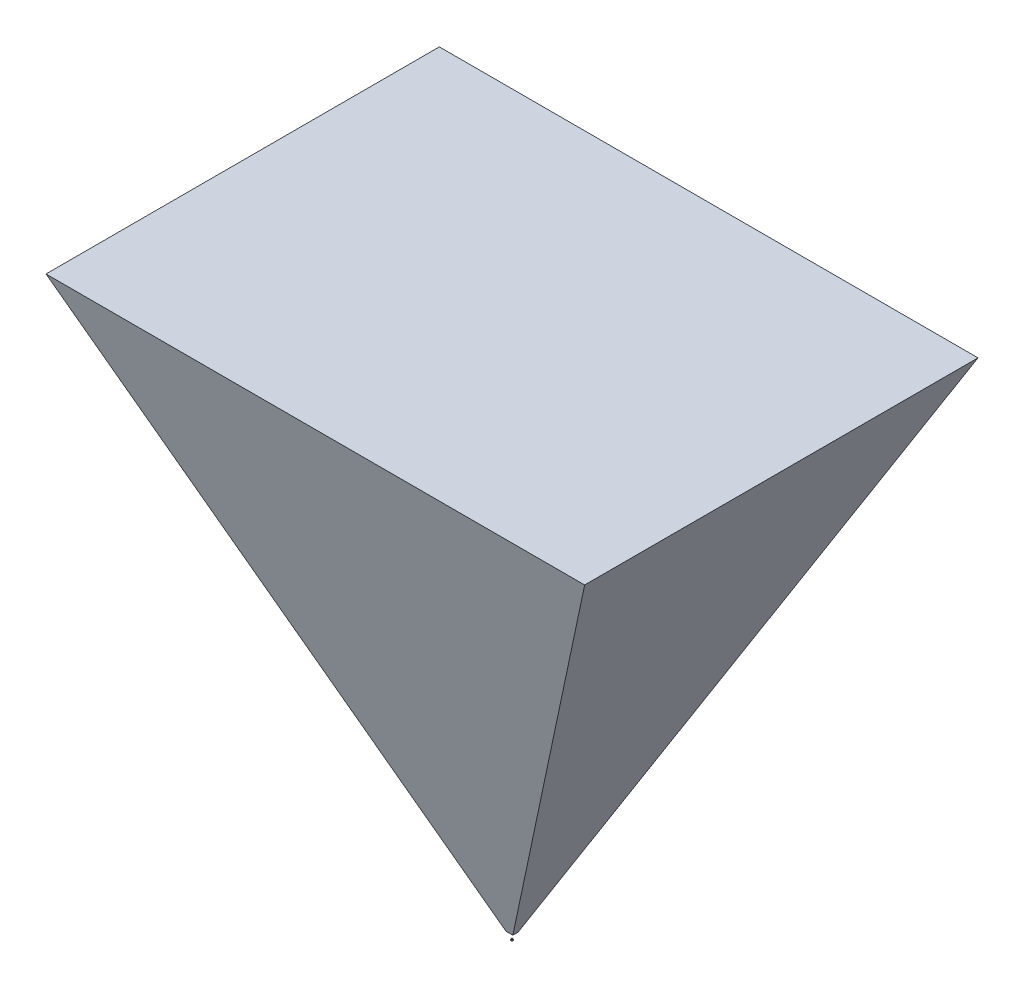
ISO-10303-21;
HEADER;
FILE_DESCRIPTION(('STEP AP214'),'2;1');
FILE_NAME('part.step','',(''),(''),'','','');
FILE_SCHEMA(('AUTOMOTIVE_DESIGN { 1 0 10303 214 1 1 1 1 }'));
ENDSEC;
DATA;
#1=APPLICATION_CONTEXT('core data for automotive mechanical design processes');
#2=APPLICATION_PROTOCOL_DEFINITION('international standard','automotive_design',2000,#1);
#3=PRODUCT_CONTEXT('',#1,'mechanical');
#4=PRODUCT('Part','Part','',(#3));
#5=PRODUCT_RELATED_PRODUCT_CATEGORY('part','',(#4));
#6=PRODUCT_DEFINITION_FORMATION('','',#4);
#7=PRODUCT_DEFINITION_CONTEXT('part definition',#1,'design');
#8=PRODUCT_DEFINITION('design','',#6,#7);
#9=PRODUCT_DEFINITION_SHAPE('','',#8);
#10=(LENGTH_UNIT() NAMED_UNIT(*) SI_UNIT(.MILLI.,.METRE.));
#11=(NAMED_UNIT(*) PLANE_ANGLE_UNIT() SI_UNIT($,.RADIAN.));
#12=(NAMED_UNIT(*) SI_UNIT($,.STERADIAN.) SOLID_ANGLE_UNIT());
#13=UNCERTAINTY_MEASURE_WITH_UNIT(LENGTH_MEASURE(1.E-05),#10,'distance_accuracy_value','');
#14=(GEOMETRIC_REPRESENTATION_CONTEXT(3) GLOBAL_UNCERTAINTY_ASSIGNED_CONTEXT((#13)) GLOBAL_UNIT_ASSIGNED_CONTEXT((#10,
#11,#12)) REPRESENTATION_CONTEXT('',''));
#15=CARTESIAN_POINT('',(0.,0.,0.));
#16=DIRECTION('',(0.,0.,1.));
#17=DIRECTION('',(1.,0.,0.));
#18=AXIS2_PLACEMENT_3D('',#15,#16,#17);
#19=CARTESIAN_POINT('',(1500.,1548.70782661284,564.153863112612));
#20=DIRECTION('',(0.,-1.,0.));
#21=DIRECTION('',(0.,0.,-1.));
#22=AXIS2_PLACEMENT_3D('',#19,#20,#21);
#23=PLANE('',#22);
#24=DIRECTION('',(0.,0.,1.));
#25=VECTOR('',#24,1.);
#26=CARTESIAN_POINT('',(-772.570341414146,1548.70782661284,-564.153863112612));
#27=LINE('',#26,#25);
#28=CARTESIAN_POINT('',(-772.570341414146,1548.70782661284,-564.153863112612));
#29=VERTEX_POINT('',#28);
#30=CARTESIAN_POINT('',(-772.570341414146,1548.70782661284,564.153863112612));
#31=VERTEX_POINT('',#30);
#32=EDGE_CURVE('E66',#29,#31,#27,.T.);
#33=ORIENTED_EDGE('',*,*,#32,.T.);
#34=DIRECTION('',(-1.,0.,0.));
#35=VECTOR('',#34,1.);
#36=CARTESIAN_POINT('',(1500.,1548.70782661284,564.153863112612));
#37=LINE('',#36,#35);
#38=CARTESIAN_POINT('',(772.570341414146,1548.70782661284,564.153863112612));
#39=VERTEX_POINT('',#38);
#40=EDGE_CURVE('E96',#39,#31,#37,.T.);
#41=ORIENTED_EDGE('',*,*,#40,.F.);
#42=DIRECTION('',(0.,0.,1.));
#43=VECTOR('',#42,1.);
#44=CARTESIAN_POINT('',(772.570341414146,1548.70782661284,-564.153863112612));
#45=LINE('',#44,#43);
#46=CARTESIAN_POINT('',(772.570341414146,1548.70782661284,-564.153863112612));
#47=VERTEX_POINT('',#46);
#48=EDGE_CURVE('E82',#47,#39,#45,.T.);
#49=ORIENTED_EDGE('',*,*,#48,.F.);
#50=DIRECTION('',(-1.,0.,0.));
#51=VECTOR('',#50,1.);
#52=CARTESIAN_POINT('',(1500.,1548.70782661284,-564.153863112612));
#53=LINE('',#52,#51);
#54=EDGE_CURVE('E108',#47,#29,#53,.T.);
#55=ORIENTED_EDGE('',*,*,#54,.T.);
#56=EDGE_LOOP('',(#33,#41,#49,#55));
#57=FACE_BOUND('',#56,.T.);
#58=ADVANCED_FACE('F45',(#57),#23,.F.);
#59=CARTESIAN_POINT('',(1500.,18.7078266128409,7.27940468532404));
#60=DIRECTION('',(0.,0.342020143325668,-0.939692620785909));
#61=DIRECTION('',(0.,0.939692620785909,0.342020143325668));
#62=AXIS2_PLACEMENT_3D('',#59,#60,#61);
#63=PLANE('',#62);
#64=DIRECTION('',(-0.424258256279284,0.850930418263275,0.309713343679521));
#65=VECTOR('',#64,1.);
#66=CARTESIAN_POINT('',(262.0053594961,-526.330009117692,-191.098144069461));
#67=LINE('',#66,#65);
#68=CARTESIAN_POINT('',(-9.7404810923923,18.7078266128409,7.27940468532406));
#69=VERTEX_POINT('',#68);
#70=EDGE_CURVE('E99',#69,#31,#67,.T.);
#71=ORIENTED_EDGE('',*,*,#70,.F.);
#72=DIRECTION('',(-1.,0.,0.));
#73=VECTOR('',#72,1.);
#74=CARTESIAN_POINT('',(1500.,18.7078266128409,7.27940468532404));
#75=LINE('',#74,#73);
#76=CARTESIAN_POINT('',(9.7404810923923,18.7078266128409,7.27940468532406));
#77=VERTEX_POINT('',#76);
#78=EDGE_CURVE('E98',#77,#69,#75,.T.);
#79=ORIENTED_EDGE('',*,*,#78,.F.);
#80=DIRECTION('',(-0.424258256279284,-0.850930418263275,-0.309713343679521));
#81=VECTOR('',#80,1.);
#82=CARTESIAN_POINT('',(277.979844567317,556.712757284446,203.097185338239));
#83=LINE('',#82,#81);
#84=EDGE_CURVE('E85',#39,#77,#83,.T.);
#85=ORIENTED_EDGE('',*,*,#84,.F.);
#86=ORIENTED_EDGE('',*,*,#40,.T.);
#87=EDGE_LOOP('',(#71,#79,#85,#86));
#88=FACE_BOUND('',#87,.T.);
#89=ADVANCED_FACE('F95',(#88),#63,.F.);
#90=CARTESIAN_POINT('',(1500.,18.7078266128409,7.27940468532404));
#91=DIRECTION('',(0.,1.,0.));
#92=DIRECTION('',(0.,0.,1.));
#93=AXIS2_PLACEMENT_3D('',#90,#91,#92);
#94=PLANE('',#93);
#95=DIRECTION('',(0.,0.,1.));
#96=VECTOR('',#95,1.);
#97=CARTESIAN_POINT('',(-9.7404810923923,18.7078266128409,-564.153863112612));
#98=LINE('',#97,#96);
#99=CARTESIAN_POINT('',(-9.74048109239227,18.7078266128409,-7.27940468532404));
#100=VERTEX_POINT('',#99);
#101=EDGE_CURVE('E100',#100,#69,#98,.T.);
#102=ORIENTED_EDGE('',*,*,#101,.F.);
#103=DIRECTION('',(-1.,0.,0.));
#104=VECTOR('',#103,1.);
#105=CARTESIAN_POINT('',(1500.,18.7078266128409,-7.27940468532404));
#106=LINE('',#105,#104);
#107=CARTESIAN_POINT('',(9.7404810923922,18.7078266128409,-7.27940468532405));
#108=VERTEX_POINT('',#107);
#109=EDGE_CURVE('E103',#108,#100,#106,.T.);
#110=ORIENTED_EDGE('',*,*,#109,.F.);
#111=DIRECTION('',(0.,0.,1.));
#112=VECTOR('',#111,1.);
#113=CARTESIAN_POINT('',(9.7404810923923,18.7078266128409,-564.153863112612));
#114=LINE('',#113,#112);
#115=EDGE_CURVE('E59',#108,#77,#114,.T.);
#116=ORIENTED_EDGE('',*,*,#115,.T.);
#117=ORIENTED_EDGE('',*,*,#78,.T.);
#118=EDGE_LOOP('',(#102,#110,#116,#117));
#119=FACE_BOUND('',#118,.T.);
#120=ADVANCED_FACE('F117',(#119),#94,.F.);
#121=CARTESIAN_POINT('',(1500.,18.7078266128409,-7.27940468532404));
#122=DIRECTION('',(0.,0.342020143325668,0.939692620785909));
#123=DIRECTION('',(0.,-0.939692620785909,0.342020143325668));
#124=AXIS2_PLACEMENT_3D('',#121,#122,#123);
#125=PLANE('',#124);
#126=DIRECTION('',(0.424258256279284,-0.850930418263275,0.309713343679521));
#127=VECTOR('',#126,1.);
#128=CARTESIAN_POINT('',(262.0053594961,-526.330009117692,191.098144069461));
#129=LINE('',#128,#127);
#130=EDGE_CURVE('E13',#29,#100,#129,.T.);
#131=ORIENTED_EDGE('',*,*,#130,.F.);
#132=ORIENTED_EDGE('',*,*,#54,.F.);
#133=DIRECTION('',(0.424258256279284,0.850930418263275,-0.309713343679521));
#134=VECTOR('',#133,1.);
#135=CARTESIAN_POINT('',(277.979844567317,556.712757284446,-203.097185338239));
#136=LINE('',#135,#134);
#137=EDGE_CURVE('E52',#108,#47,#136,.T.);
#138=ORIENTED_EDGE('',*,*,#137,.F.);
#139=ORIENTED_EDGE('',*,*,#109,.T.);
#140=EDGE_LOOP('',(#131,#132,#138,#139));
#141=FACE_BOUND('',#140,.T.);
#142=ADVANCED_FACE('F119',(#141),#125,.F.);
#143=CARTESIAN_POINT('',(9.7404810923923,18.7078266128409,-564.153863112612));
#144=DIRECTION('',(0.894934361602024,-0.44619781310981,0.));
#145=DIRECTION('',(0.44619781310981,0.894934361602024,0.));
#146=AXIS2_PLACEMENT_3D('',#143,#144,#145);
#147=PLANE('',#146);
#148=ORIENTED_EDGE('',*,*,#84,.T.);
#149=ORIENTED_EDGE('',*,*,#115,.F.);
#150=ORIENTED_EDGE('',*,*,#137,.T.);
#151=ORIENTED_EDGE('',*,*,#48,.T.);
#152=EDGE_LOOP('',(#148,#149,#150,#151));
#153=FACE_BOUND('',#152,.T.);
#154=ADVANCED_FACE('F84',(#153),#147,.T.);
#155=CARTESIAN_POINT('',(-9.7404810923923,18.7078266128409,-564.153863112612));
#156=DIRECTION('',(-0.894934361602024,-0.44619781310981,0.));
#157=DIRECTION('',(0.44619781310981,-0.894934361602024,0.));
#158=AXIS2_PLACEMENT_3D('',#155,#156,#157);
#159=PLANE('',#158);
#160=ORIENTED_EDGE('',*,*,#70,.T.);
#161=ORIENTED_EDGE('',*,*,#32,.F.);
#162=ORIENTED_EDGE('',*,*,#130,.T.);
#163=ORIENTED_EDGE('',*,*,#101,.T.);
#164=EDGE_LOOP('',(#160,#161,#162,#163));
#165=FACE_BOUND('',#164,.T.);
#166=ADVANCED_FACE('F114',(#165),#159,.T.);
#167=CLOSED_SHELL('',(#58,#89,#120,#142,#154,#166));
#168=MANIFOLD_SOLID_BREP('B2',#167);
#169=CARTESIAN_POINT('',(1.,0.8,0.));
#170=DIRECTION('',(0.,-1.,0.));
#171=DIRECTION('',(0.,0.,-1.));
#172=AXIS2_PLACEMENT_3D('',#169,#170,#171);
#173=PLANE('',#172);
#174=CARTESIAN_POINT('',(0.,0.8,0.));
#175=DIRECTION('',(0.,1.,0.));
#176=DIRECTION('',(0.,0.,1.));
#177=AXIS2_PLACEMENT_3D('',#174,#175,#176);
#178=CIRCLE('',#177,1.);
#179=CARTESIAN_POINT('',(0.,0.8,1.));
#180=VERTEX_POINT('',#179);
#181=EDGE_CURVE('E43',#180,#180,#178,.T.);
#182=ORIENTED_EDGE('',*,*,#181,.F.);
#183=EDGE_LOOP('',(#182));
#184=FACE_BOUND('',#183,.T.);
#185=DIRECTION('',(0.,0.,-1.));
#186=VECTOR('',#185,1.);
#187=CARTESIAN_POINT('',(0.,0.8,2.3));
#188=LINE('',#187,#186);
#189=CARTESIAN_POINT('',(0.,0.8,2.75));
#190=VERTEX_POINT('',#189);
#191=CARTESIAN_POINT('',(0.,0.8,2.3));
#192=VERTEX_POINT('',#191);
#193=EDGE_CURVE('E273',#190,#192,#188,.T.);
#194=ORIENTED_EDGE('',*,*,#193,.T.);
#195=CARTESIAN_POINT('',(0.,0.8,0.));
#196=DIRECTION('',(0.,1.,0.));
#197=DIRECTION('',(-0.866025403784443,0.,-0.499999999999992));
#198=AXIS2_PLACEMENT_3D('',#195,#196,#197);
#199=CIRCLE('',#198,2.3);
#200=CARTESIAN_POINT('',(1.99185842870422,0.8,1.14999999999998));
#201=VERTEX_POINT('',#200);
#202=EDGE_CURVE('E258',#192,#201,#199,.T.);
#203=ORIENTED_EDGE('',*,*,#202,.T.);
#204=DIRECTION('',(-0.866025403784443,0.,-0.499999999999992));
#205=VECTOR('',#204,1.);
#206=CARTESIAN_POINT('',(1.99185842870422,0.8,1.14999999999998));
#207=LINE('',#206,#205);
#208=CARTESIAN_POINT('',(2.38156986040722,0.8,1.37499999999998));
#209=VERTEX_POINT('',#208);
#210=EDGE_CURVE('E264',#209,#201,#207,.T.);
#211=ORIENTED_EDGE('',*,*,#210,.F.);
#212=CARTESIAN_POINT('',(0.,0.8,0.));
#213=DIRECTION('',(0.,1.,0.));
#214=DIRECTION('',(0.,0.,1.));
#215=AXIS2_PLACEMENT_3D('',#212,#213,#214);
#216=CIRCLE('',#215,2.75);
#217=CARTESIAN_POINT('',(2.38156986040721,0.8,-1.37499999999999));
#218=VERTEX_POINT('',#217);
#219=EDGE_CURVE('E344',#209,#218,#216,.T.);
#220=ORIENTED_EDGE('',*,*,#219,.T.);
#221=DIRECTION('',(-0.86602540378444,0.,0.499999999999998));
#222=VECTOR('',#221,1.);
#223=CARTESIAN_POINT('',(1.99185842870421,0.8,-1.15));
#224=LINE('',#223,#222);
#225=CARTESIAN_POINT('',(1.99185842870421,0.8,-1.15));
#226=VERTEX_POINT('',#225);
#227=EDGE_CURVE('E307',#218,#226,#224,.T.);
#228=ORIENTED_EDGE('',*,*,#227,.T.);
#229=CARTESIAN_POINT('',(0.,0.8,0.));
#230=DIRECTION('',(0.,1.,0.));
#231=DIRECTION('',(0.,0.,1.));
#232=AXIS2_PLACEMENT_3D('',#229,#230,#231);
#233=CIRCLE('',#232,2.3);
#234=CARTESIAN_POINT('',(0.,0.8,-2.3));
#235=VERTEX_POINT('',#234);
#236=EDGE_CURVE('E315',#226,#235,#233,.T.);
#237=ORIENTED_EDGE('',*,*,#236,.T.);
#238=DIRECTION('',(0.,0.,1.));
#239=VECTOR('',#238,1.);
#240=CARTESIAN_POINT('',(0.,0.8,-2.3));
#241=LINE('',#240,#239);
#242=CARTESIAN_POINT('',(0.,0.8,-2.75));
#243=VERTEX_POINT('',#242);
#244=EDGE_CURVE('E300',#243,#235,#241,.T.);
#245=ORIENTED_EDGE('',*,*,#244,.F.);
#246=CARTESIAN_POINT('',(-2.38156986040721,0.8,-1.37499999999999));
#247=VERTEX_POINT('',#246);
#248=EDGE_CURVE('E195',#243,#247,#216,.T.);
#249=ORIENTED_EDGE('',*,*,#248,.T.);
#250=DIRECTION('',(0.86602540378444,0.,0.499999999999998));
#251=VECTOR('',#250,1.);
#252=CARTESIAN_POINT('',(-1.99185842870421,0.8,-1.15));
#253=LINE('',#252,#251);
#254=CARTESIAN_POINT('',(-1.99185842870421,0.8,-1.15));
#255=VERTEX_POINT('',#254);
#256=EDGE_CURVE('E287',#247,#255,#253,.T.);
#257=ORIENTED_EDGE('',*,*,#256,.T.);
#258=CARTESIAN_POINT('',(0.,0.8,0.));
#259=DIRECTION('',(0.,1.,0.));
#260=DIRECTION('',(0.866025403784436,0.,-0.500000000000004));
#261=AXIS2_PLACEMENT_3D('',#258,#259,#260);
#262=CIRCLE('',#261,2.3);
#263=CARTESIAN_POINT('',(-1.9918584287042,0.8,1.15000000000001));
#264=VERTEX_POINT('',#263);
#265=EDGE_CURVE('E295',#255,#264,#262,.T.);
#266=ORIENTED_EDGE('',*,*,#265,.T.);
#267=DIRECTION('',(0.866025403784436,0.,-0.500000000000004));
#268=VECTOR('',#267,1.);
#269=CARTESIAN_POINT('',(-1.9918584287042,0.8,1.15000000000001));
#270=LINE('',#269,#268);
#271=CARTESIAN_POINT('',(-2.3815698604072,0.8,1.37500000000001));
#272=VERTEX_POINT('',#271);
#273=EDGE_CURVE('E276',#272,#264,#270,.T.);
#274=ORIENTED_EDGE('',*,*,#273,.F.);
#275=EDGE_CURVE('E346',#272,#190,#216,.T.);
#276=ORIENTED_EDGE('',*,*,#275,.T.);
#277=EDGE_LOOP('',(#194,#203,#211,#220,#228,#237,#245,#249,#257,#266,#274,#276));
#278=FACE_BOUND('',#277,.T.);
#279=ADVANCED_FACE('F187',(#184,#278),#173,.F.);
#280=CARTESIAN_POINT('',(0.,0.,0.));
#281=DIRECTION('',(0.,1.,0.));
#282=DIRECTION('',(0.,0.,1.));
#283=AXIS2_PLACEMENT_3D('',#280,#281,#282);
#284=CYLINDRICAL_SURFACE('',#283,2.75);
#285=CARTESIAN_POINT('',(0.,-0.2,0.));
#286=DIRECTION('',(0.,-1.,0.));
#287=DIRECTION('',(0.,0.,-1.));
#288=AXIS2_PLACEMENT_3D('',#285,#286,#287);
#289=CIRCLE('',#288,2.75);
#290=CARTESIAN_POINT('',(0.,-0.2,-2.75));
#291=VERTEX_POINT('',#290);
#292=EDGE_CURVE('E321',#291,#291,#289,.T.);
#293=ORIENTED_EDGE('',*,*,#292,.F.);
#294=EDGE_LOOP('',(#293));
#295=FACE_BOUND('',#294,.T.);
#296=DIRECTION('',(0.,1.,0.));
#297=VECTOR('',#296,1.);
#298=CARTESIAN_POINT('',(0.,0.8,2.75));
#299=LINE('',#298,#297);
#300=CARTESIAN_POINT('',(0.,0.349999999999999,2.75));
#301=VERTEX_POINT('',#300);
#302=EDGE_CURVE('E274',#301,#190,#299,.T.);
#303=ORIENTED_EDGE('',*,*,#302,.T.);
#304=ORIENTED_EDGE('',*,*,#275,.F.);
#305=DIRECTION('',(0.,1.,0.));
#306=VECTOR('',#305,1.);
#307=CARTESIAN_POINT('',(-2.3815698604072,0.8,1.37500000000001));
#308=LINE('',#307,#306);
#309=CARTESIAN_POINT('',(-2.3815698604072,0.349999999999999,1.37500000000001));
#310=VERTEX_POINT('',#309);
#311=EDGE_CURVE('E285',#310,#272,#308,.T.);
#312=ORIENTED_EDGE('',*,*,#311,.F.);
#313=CARTESIAN_POINT('',(0.,0.349999999999999,0.));
#314=DIRECTION('',(0.,1.,0.));
#315=DIRECTION('',(0.866025403784436,0.,-0.500000000000004));
#316=AXIS2_PLACEMENT_3D('',#313,#314,#315);
#317=CIRCLE('',#316,2.75);
#318=CARTESIAN_POINT('',(-2.38156986040721,0.349999999999999,-1.37499999999999));
#319=VERTEX_POINT('',#318);
#320=EDGE_CURVE('E298',#319,#310,#317,.T.);
#321=ORIENTED_EDGE('',*,*,#320,.F.);
#322=DIRECTION('',(0.,1.,0.));
#323=VECTOR('',#322,1.);
#324=CARTESIAN_POINT('',(-2.38156986040721,0.8,-1.37499999999999));
#325=LINE('',#324,#323);
#326=EDGE_CURVE('E292',#319,#247,#325,.T.);
#327=ORIENTED_EDGE('',*,*,#326,.T.);
#328=ORIENTED_EDGE('',*,*,#248,.F.);
#329=DIRECTION('',(0.,1.,0.));
#330=VECTOR('',#329,1.);
#331=CARTESIAN_POINT('',(0.,0.8,-2.75));
#332=LINE('',#331,#330);
#333=CARTESIAN_POINT('',(0.,0.349999999999999,-2.75));
#334=VERTEX_POINT('',#333);
#335=EDGE_CURVE('E305',#334,#243,#332,.T.);
#336=ORIENTED_EDGE('',*,*,#335,.F.);
#337=CARTESIAN_POINT('',(0.,0.349999999999999,0.));
#338=DIRECTION('',(0.,1.,0.));
#339=DIRECTION('',(0.,0.,1.));
#340=AXIS2_PLACEMENT_3D('',#337,#338,#339);
#341=CIRCLE('',#340,2.75);
#342=CARTESIAN_POINT('',(2.38156986040721,0.349999999999999,-1.37499999999999));
#343=VERTEX_POINT('',#342);
#344=EDGE_CURVE('E318',#343,#334,#341,.T.);
#345=ORIENTED_EDGE('',*,*,#344,.F.);
#346=DIRECTION('',(0.,1.,0.));
#347=VECTOR('',#346,1.);
#348=CARTESIAN_POINT('',(2.38156986040721,0.8,-1.37499999999999));
#349=LINE('',#348,#347);
#350=EDGE_CURVE('E312',#343,#218,#349,.T.);
#351=ORIENTED_EDGE('',*,*,#350,.T.);
#352=ORIENTED_EDGE('',*,*,#219,.F.);
#353=DIRECTION('',(0.,1.,0.));
#354=VECTOR('',#353,1.);
#355=CARTESIAN_POINT('',(2.38156986040722,0.8,1.37499999999998));
#356=LINE('',#355,#354);
#357=CARTESIAN_POINT('',(2.38156986040722,0.349999999999999,1.37499999999998));
#358=VERTEX_POINT('',#357);
#359=EDGE_CURVE('E263',#358,#209,#356,.T.);
#360=ORIENTED_EDGE('',*,*,#359,.F.);
#361=CARTESIAN_POINT('',(0.,0.349999999999999,0.));
#362=DIRECTION('',(0.,1.,0.));
#363=DIRECTION('',(-0.866025403784443,0.,-0.499999999999992));
#364=AXIS2_PLACEMENT_3D('',#361,#362,#363);
#365=CIRCLE('',#364,2.75);
#366=EDGE_CURVE('E261',#301,#358,#365,.T.);
#367=ORIENTED_EDGE('',*,*,#366,.F.);
#368=EDGE_LOOP('',(#303,#304,#312,#321,#327,#328,#336,#345,#351,#352,#360,#367));
#369=FACE_BOUND('',#368,.T.);
#370=ADVANCED_FACE('F356',(#295,#369),#284,.T.);
#371=CARTESIAN_POINT('',(0.,-1.2,0.));
#372=DIRECTION('',(0.,-1.,0.));
#373=DIRECTION('',(0.,0.,-1.));
#374=AXIS2_PLACEMENT_3D('',#371,#372,#373);
#375=CIRCLE('',#374,2.75);
#376=CARTESIAN_POINT('',(0.,-1.2,-2.75));
#377=VERTEX_POINT('',#376);
#378=EDGE_CURVE('E330',#377,#377,#375,.T.);
#379=ORIENTED_EDGE('',*,*,#378,.T.);
#380=EDGE_LOOP('',(#379));
#381=FACE_BOUND('',#380,.T.);
#382=CARTESIAN_POINT('',(0.,-2.55,0.));
#383=DIRECTION('',(0.,1.,0.));
#384=DIRECTION('',(0.,0.,1.));
#385=AXIS2_PLACEMENT_3D('',#382,#383,#384);
#386=CIRCLE('',#385,2.75);
#387=CARTESIAN_POINT('',(0.,-2.55,2.75));
#388=VERTEX_POINT('',#387);
#389=EDGE_CURVE('E342',#388,#388,#386,.T.);
#390=ORIENTED_EDGE('',*,*,#389,.T.);
#391=EDGE_LOOP('',(#390));
#392=FACE_BOUND('',#391,.T.);
#393=ADVANCED_FACE('F390',(#381,#392),#284,.T.);
#394=CARTESIAN_POINT('',(2.75,-2.55,0.));
#395=DIRECTION('',(0.,1.,0.));
#396=DIRECTION('',(0.,0.,1.));
#397=AXIS2_PLACEMENT_3D('',#394,#395,#396);
#398=PLANE('',#397);
#399=ORIENTED_EDGE('',*,*,#389,.F.);
#400=EDGE_LOOP('',(#399));
#401=FACE_BOUND('',#400,.T.);
#402=CARTESIAN_POINT('',(0.,-2.55,0.));
#403=DIRECTION('',(0.,1.,0.));
#404=DIRECTION('',(0.,0.,1.));
#405=AXIS2_PLACEMENT_3D('',#402,#403,#404);
#406=CIRCLE('',#405,2.1);
#407=CARTESIAN_POINT('',(0.,-2.55,2.1));
#408=VERTEX_POINT('',#407);
#409=EDGE_CURVE('E339',#408,#408,#406,.T.);
#410=ORIENTED_EDGE('',*,*,#409,.T.);
#411=EDGE_LOOP('',(#410));
#412=FACE_BOUND('',#411,.T.);
#413=ADVANCED_FACE('F395',(#401,#412),#398,.F.);
#414=CARTESIAN_POINT('',(0.,-2.25,0.));
#415=DIRECTION('',(0.,-1.,0.));
#416=DIRECTION('',(0.,0.,-1.));
#417=AXIS2_PLACEMENT_3D('',#414,#415,#416);
#418=CONICAL_SURFACE('',#417,1.8,0.78539816339745);
#419=ORIENTED_EDGE('',*,*,#409,.F.);
#420=EDGE_LOOP('',(#419));
#421=FACE_BOUND('',#420,.T.);
#422=CARTESIAN_POINT('',(0.,-2.25,0.));
#423=DIRECTION('',(0.,1.,0.));
#424=DIRECTION('',(0.,0.,1.));
#425=AXIS2_PLACEMENT_3D('',#422,#423,#424);
#426=CIRCLE('',#425,1.8);
#427=CARTESIAN_POINT('',(0.,-2.25,1.8));
#428=VERTEX_POINT('',#427);
#429=EDGE_CURVE('E336',#428,#428,#426,.T.);
#430=ORIENTED_EDGE('',*,*,#429,.T.);
#431=EDGE_LOOP('',(#430));
#432=FACE_BOUND('',#431,.T.);
#433=ADVANCED_FACE('F398',(#421,#432),#418,.F.);
#434=CARTESIAN_POINT('',(0.,3.,0.));
#435=DIRECTION('',(0.,1.,0.));
#436=DIRECTION('',(1.,0.,0.));
#437=AXIS2_PLACEMENT_3D('',#434,#435,#436);
#438=SPHERICAL_SURFACE('',#437,5.55);
#439=ORIENTED_EDGE('',*,*,#429,.F.);
#440=EDGE_LOOP('',(#439));
#441=FACE_BOUND('',#440,.T.);
#442=ADVANCED_FACE('F402',(#441),#438,.T.);
#443=CARTESIAN_POINT('',(2.75,-1.2,0.));
#444=DIRECTION('',(0.,-1.,0.));
#445=DIRECTION('',(0.,0.,-1.));
#446=AXIS2_PLACEMENT_3D('',#443,#444,#445);
#447=PLANE('',#446);
#448=CARTESIAN_POINT('',(0.,-1.2,0.));
#449=DIRECTION('',(0.,-1.,0.));
#450=DIRECTION('',(0.,0.,-1.));
#451=AXIS2_PLACEMENT_3D('',#448,#449,#450);
#452=CIRCLE('',#451,3.);
#453=CARTESIAN_POINT('',(0.,-1.2,-3.));
#454=VERTEX_POINT('',#453);
#455=EDGE_CURVE('E327',#454,#454,#452,.T.);
#456=ORIENTED_EDGE('',*,*,#455,.T.);
#457=EDGE_LOOP('',(#456));
#458=FACE_BOUND('',#457,.T.);
#459=ORIENTED_EDGE('',*,*,#378,.F.);
#460=EDGE_LOOP('',(#459));
#461=FACE_BOUND('',#460,.T.);
#462=ADVANCED_FACE('F406',(#458,#461),#447,.T.);
#463=CARTESIAN_POINT('',(0.,0.,0.));
#464=DIRECTION('',(0.,-1.,0.));
#465=DIRECTION('',(0.,0.,-1.));
#466=AXIS2_PLACEMENT_3D('',#463,#464,#465);
#467=CYLINDRICAL_SURFACE('',#466,3.);
#468=CARTESIAN_POINT('',(0.,-0.2,0.));
#469=DIRECTION('',(0.,-1.,0.));
#470=DIRECTION('',(0.,0.,-1.));
#471=AXIS2_PLACEMENT_3D('',#468,#469,#470);
#472=CIRCLE('',#471,3.);
#473=CARTESIAN_POINT('',(0.,-0.2,-3.));
#474=VERTEX_POINT('',#473);
#475=EDGE_CURVE('E324',#474,#474,#472,.T.);
#476=ORIENTED_EDGE('',*,*,#475,.T.);
#477=EDGE_LOOP('',(#476));
#478=FACE_BOUND('',#477,.T.);
#479=ORIENTED_EDGE('',*,*,#455,.F.);
#480=EDGE_LOOP('',(#479));
#481=FACE_BOUND('',#480,.T.);
#482=ADVANCED_FACE('F415',(#478,#481),#467,.T.);
#483=CARTESIAN_POINT('',(2.75,-0.2,0.));
#484=DIRECTION('',(0.,1.,0.));
#485=DIRECTION('',(0.,0.,1.));
#486=AXIS2_PLACEMENT_3D('',#483,#484,#485);
#487=PLANE('',#486);
#488=ORIENTED_EDGE('',*,*,#292,.T.);
#489=EDGE_LOOP('',(#488));
#490=FACE_BOUND('',#489,.T.);
#491=ORIENTED_EDGE('',*,*,#475,.F.);
#492=EDGE_LOOP('',(#491));
#493=FACE_BOUND('',#492,.T.);
#494=ADVANCED_FACE('F411',(#490,#493),#487,.T.);
#495=CARTESIAN_POINT('',(0.,-1.478125,0.));
#496=DIRECTION('',(0.,1.,0.));
#497=DIRECTION('',(1.,0.,0.));
#498=AXIS2_PLACEMENT_3D('',#495,#496,#497);
#499=SPHERICAL_SURFACE('',#498,2.003125);
#500=CARTESIAN_POINT('',(0.,0.425,0.));
#501=DIRECTION('',(0.,1.,0.));
#502=DIRECTION('',(0.,0.,1.));
#503=AXIS2_PLACEMENT_3D('',#500,#501,#502);
#504=CIRCLE('',#503,0.625);
#505=CARTESIAN_POINT('',(0.,0.425,0.625));
#506=VERTEX_POINT('',#505);
#507=EDGE_CURVE('E333',#506,#506,#504,.T.);
#508=ORIENTED_EDGE('',*,*,#507,.T.);
#509=EDGE_LOOP('',(#508));
#510=FACE_BOUND('',#509,.T.);
#511=ADVANCED_FACE('F408',(#510),#499,.T.);
#512=CARTESIAN_POINT('',(0.,0.8,0.));
#513=DIRECTION('',(0.,1.,0.));
#514=DIRECTION('',(0.,0.,1.));
#515=AXIS2_PLACEMENT_3D('',#512,#513,#514);
#516=CONICAL_SURFACE('',#515,1.,0.785398163397449);
#517=ORIENTED_EDGE('',*,*,#507,.F.);
#518=EDGE_LOOP('',(#517));
#519=FACE_BOUND('',#518,.T.);
#520=ORIENTED_EDGE('',*,*,#181,.T.);
#521=EDGE_LOOP('',(#520));
#522=FACE_BOUND('',#521,.T.);
#523=ADVANCED_FACE('F189',(#519,#522),#516,.F.);
#524=CARTESIAN_POINT('',(0.,0.8,0.));
#525=DIRECTION('',(0.,-1.,0.));
#526=DIRECTION('',(0.,0.,-1.));
#527=AXIS2_PLACEMENT_3D('',#524,#525,#526);
#528=CONICAL_SURFACE('',#527,2.3,0.785398163397448);
#529=DIRECTION('',(0.612372435695795,-0.707106781186547,-0.353553390593272));
#530=VECTOR('',#529,1.);
#531=CARTESIAN_POINT('',(2.38156986040721,0.349999999999999,-1.37499999999999));
#532=LINE('',#531,#530);
#533=EDGE_CURVE('E310',#226,#343,#532,.T.);
#534=ORIENTED_EDGE('',*,*,#533,.T.);
#535=ORIENTED_EDGE('',*,*,#344,.T.);
#536=DIRECTION('',(0.,-0.707106781186547,-0.707106781186547));
#537=VECTOR('',#536,1.);
#538=CARTESIAN_POINT('',(0.,0.349999999999999,-2.75));
#539=LINE('',#538,#537);
#540=EDGE_CURVE('E303',#235,#334,#539,.T.);
#541=ORIENTED_EDGE('',*,*,#540,.F.);
#542=ORIENTED_EDGE('',*,*,#236,.F.);
#543=EDGE_LOOP('',(#534,#535,#541,#542));
#544=FACE_BOUND('',#543,.T.);
#545=ADVANCED_FACE('F359',(#544),#528,.T.);
#546=CARTESIAN_POINT('',(0.,0.,0.));
#547=DIRECTION('',(-0.499999999999998,0.,-0.86602540378444));
#548=DIRECTION('',(-0.86602540378444,0.,0.499999999999998));
#549=AXIS2_PLACEMENT_3D('',#546,#547,#548);
#550=PLANE('',#549);
#551=ORIENTED_EDGE('',*,*,#227,.F.);
#552=ORIENTED_EDGE('',*,*,#350,.F.);
#553=ORIENTED_EDGE('',*,*,#533,.F.);
#554=EDGE_LOOP('',(#551,#552,#553));
#555=FACE_BOUND('',#554,.T.);
#556=ADVANCED_FACE('F354',(#555),#550,.T.);
#557=CARTESIAN_POINT('',(0.,0.,0.));
#558=DIRECTION('',(-1.,0.,0.));
#559=DIRECTION('',(0.,0.,1.));
#560=AXIS2_PLACEMENT_3D('',#557,#558,#559);
#561=PLANE('',#560);
#562=ORIENTED_EDGE('',*,*,#244,.T.);
#563=ORIENTED_EDGE('',*,*,#540,.T.);
#564=ORIENTED_EDGE('',*,*,#335,.T.);
#565=EDGE_LOOP('',(#562,#563,#564));
#566=FACE_BOUND('',#565,.T.);
#567=ADVANCED_FACE('F427',(#566),#561,.F.);
#568=CARTESIAN_POINT('',(0.,0.8,0.));
#569=DIRECTION('',(0.,-1.,0.));
#570=DIRECTION('',(-0.866025403784436,0.,0.500000000000004));
#571=AXIS2_PLACEMENT_3D('',#568,#569,#570);
#572=CONICAL_SURFACE('',#571,2.3,0.785398163397448);
#573=DIRECTION('',(-0.612372435695795,-0.707106781186547,-0.353553390593272));
#574=VECTOR('',#573,1.);
#575=CARTESIAN_POINT('',(-2.38156986040721,0.349999999999999,-1.37499999999999));
#576=LINE('',#575,#574);
#577=EDGE_CURVE('E290',#255,#319,#576,.T.);
#578=ORIENTED_EDGE('',*,*,#577,.T.);
#579=ORIENTED_EDGE('',*,*,#320,.T.);
#580=DIRECTION('',(-0.612372435695793,-0.707106781186547,0.353553390593277));
#581=VECTOR('',#580,1.);
#582=CARTESIAN_POINT('',(-2.3815698604072,0.349999999999999,1.37500000000001));
#583=LINE('',#582,#581);
#584=EDGE_CURVE('E210',#264,#310,#583,.T.);
#585=ORIENTED_EDGE('',*,*,#584,.F.);
#586=ORIENTED_EDGE('',*,*,#265,.F.);
#587=EDGE_LOOP('',(#578,#579,#585,#586));
#588=FACE_BOUND('',#587,.T.);
#589=ADVANCED_FACE('F370',(#588),#572,.T.);
#590=CARTESIAN_POINT('',(0.,0.,0.));
#591=DIRECTION('',(-0.499999999999998,0.,0.86602540378444));
#592=DIRECTION('',(0.86602540378444,0.,0.499999999999998));
#593=AXIS2_PLACEMENT_3D('',#590,#591,#592);
#594=PLANE('',#593);
#595=ORIENTED_EDGE('',*,*,#256,.F.);
#596=ORIENTED_EDGE('',*,*,#326,.F.);
#597=ORIENTED_EDGE('',*,*,#577,.F.);
#598=EDGE_LOOP('',(#595,#596,#597));
#599=FACE_BOUND('',#598,.T.);
#600=ADVANCED_FACE('F366',(#599),#594,.T.);
#601=CARTESIAN_POINT('',(0.,0.,0.));
#602=DIRECTION('',(0.500000000000004,0.,0.866025403784436));
#603=DIRECTION('',(0.866025403784436,0.,-0.500000000000004));
#604=AXIS2_PLACEMENT_3D('',#601,#602,#603);
#605=PLANE('',#604);
#606=ORIENTED_EDGE('',*,*,#273,.T.);
#607=ORIENTED_EDGE('',*,*,#584,.T.);
#608=ORIENTED_EDGE('',*,*,#311,.T.);
#609=EDGE_LOOP('',(#606,#607,#608));
#610=FACE_BOUND('',#609,.T.);
#611=ADVANCED_FACE('F371',(#610),#605,.F.);
#612=CARTESIAN_POINT('',(0.,0.8,0.));
#613=DIRECTION('',(0.,-1.,0.));
#614=DIRECTION('',(0.866025403784443,0.,0.499999999999992));
#615=AXIS2_PLACEMENT_3D('',#612,#613,#614);
#616=CONICAL_SURFACE('',#615,2.3,0.785398163397448);
#617=DIRECTION('',(0.,-0.707106781186547,0.707106781186547));
#618=VECTOR('',#617,1.);
#619=CARTESIAN_POINT('',(0.,0.349999999999999,2.75));
#620=LINE('',#619,#618);
#621=EDGE_CURVE('E279',#192,#301,#620,.T.);
#622=ORIENTED_EDGE('',*,*,#621,.T.);
#623=ORIENTED_EDGE('',*,*,#366,.T.);
#624=DIRECTION('',(0.612372435695798,-0.707106781186547,0.353553390593268));
#625=VECTOR('',#624,1.);
#626=CARTESIAN_POINT('',(2.38156986040722,0.349999999999999,1.37499999999998));
#627=LINE('',#626,#625);
#628=EDGE_CURVE('E202',#201,#358,#627,.T.);
#629=ORIENTED_EDGE('',*,*,#628,.F.);
#630=ORIENTED_EDGE('',*,*,#202,.F.);
#631=EDGE_LOOP('',(#622,#623,#629,#630));
#632=FACE_BOUND('',#631,.T.);
#633=ADVANCED_FACE('F256',(#632),#616,.T.);
#634=CARTESIAN_POINT('',(0.,0.,0.));
#635=DIRECTION('',(1.,0.,0.));
#636=DIRECTION('',(0.,0.,-1.));
#637=AXIS2_PLACEMENT_3D('',#634,#635,#636);
#638=PLANE('',#637);
#639=ORIENTED_EDGE('',*,*,#193,.F.);
#640=ORIENTED_EDGE('',*,*,#302,.F.);
#641=ORIENTED_EDGE('',*,*,#621,.F.);
#642=EDGE_LOOP('',(#639,#640,#641));
#643=FACE_BOUND('',#642,.T.);
#644=ADVANCED_FACE('F374',(#643),#638,.T.);
#645=CARTESIAN_POINT('',(0.,0.,0.));
#646=DIRECTION('',(0.499999999999992,0.,-0.866025403784443));
#647=DIRECTION('',(-0.866025403784443,0.,-0.499999999999992));
#648=AXIS2_PLACEMENT_3D('',#645,#646,#647);
#649=PLANE('',#648);
#650=ORIENTED_EDGE('',*,*,#210,.T.);
#651=ORIENTED_EDGE('',*,*,#628,.T.);
#652=ORIENTED_EDGE('',*,*,#359,.T.);
#653=EDGE_LOOP('',(#650,#651,#652));
#654=FACE_BOUND('',#653,.T.);
#655=ADVANCED_FACE('F267',(#654),#649,.F.);
#656=CLOSED_SHELL('',(#279,#370,#393,#413,#433,#442,#462,#482,#494,#511,#523,#545,#556,#567,
#589,#600,#611,#633,#644,#655));
#657=MANIFOLD_SOLID_BREP('B7',#656);
#658=ADVANCED_BREP_SHAPE_REPRESENTATION('',(#18,#168,#657),#14);
#659=SHAPE_DEFINITION_REPRESENTATION(#9,#658);
ENDSEC;
END-ISO-10303-21;
